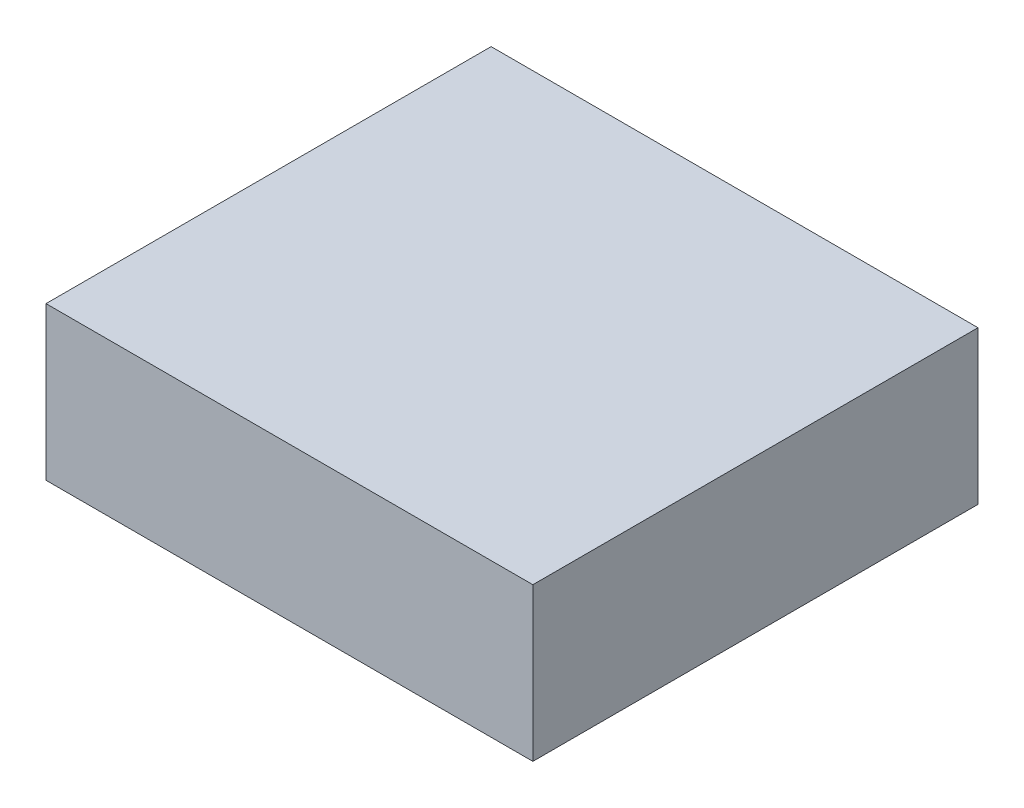
ISO-10303-21;
HEADER;
FILE_DESCRIPTION(('STEP AP214'),'2;1');
FILE_NAME('part.step','',(''),(''),'','','');
FILE_SCHEMA(('AUTOMOTIVE_DESIGN { 1 0 10303 214 1 1 1 1 }'));
ENDSEC;
DATA;
#1=APPLICATION_CONTEXT('core data for automotive mechanical design processes');
#2=APPLICATION_PROTOCOL_DEFINITION('international standard','automotive_design',2000,#1);
#3=PRODUCT_CONTEXT('',#1,'mechanical');
#4=PRODUCT('Part','Part','',(#3));
#5=PRODUCT_RELATED_PRODUCT_CATEGORY('part','',(#4));
#6=PRODUCT_DEFINITION_FORMATION('','',#4);
#7=PRODUCT_DEFINITION_CONTEXT('part definition',#1,'design');
#8=PRODUCT_DEFINITION('design','',#6,#7);
#9=PRODUCT_DEFINITION_SHAPE('','',#8);
#10=(LENGTH_UNIT() NAMED_UNIT(*) SI_UNIT(.MILLI.,.METRE.));
#11=(NAMED_UNIT(*) PLANE_ANGLE_UNIT() SI_UNIT($,.RADIAN.));
#12=(NAMED_UNIT(*) SI_UNIT($,.STERADIAN.) SOLID_ANGLE_UNIT());
#13=UNCERTAINTY_MEASURE_WITH_UNIT(LENGTH_MEASURE(1.E-05),#10,'distance_accuracy_value','');
#14=(GEOMETRIC_REPRESENTATION_CONTEXT(3) GLOBAL_UNCERTAINTY_ASSIGNED_CONTEXT((#13)) GLOBAL_UNIT_ASSIGNED_CONTEXT((#10,
#11,#12)) REPRESENTATION_CONTEXT('',''));
#15=CARTESIAN_POINT('',(0.,0.,0.));
#16=DIRECTION('',(0.,0.,1.));
#17=DIRECTION('',(1.,0.,0.));
#18=AXIS2_PLACEMENT_3D('',#15,#16,#17);
#19=CARTESIAN_POINT('',(-0.87499952,0.27500072,1.59999934));
#20=DIRECTION('',(0.,0.,1.));
#21=DIRECTION('',(1.,0.,0.));
#22=AXIS2_PLACEMENT_3D('',#19,#20,#21);
#23=PLANE('',#22);
#24=DIRECTION('',(0.,1.,0.));
#25=VECTOR('',#24,1.);
#26=CARTESIAN_POINT('',(-0.87499952,-0.27499818,1.59999934));
#27=LINE('',#26,#25);
#28=CARTESIAN_POINT('',(-0.87499952,-0.27499818,1.59999934));
#29=VERTEX_POINT('',#28);
#30=CARTESIAN_POINT('',(-0.87499952,0.27500072,1.59999934));
#31=VERTEX_POINT('',#30);
#32=EDGE_CURVE('E26',#29,#31,#27,.T.);
#33=ORIENTED_EDGE('',*,*,#32,.F.);
#34=DIRECTION('',(-1.,0.,0.));
#35=VECTOR('',#34,1.);
#36=CARTESIAN_POINT('',(0.87500206,-0.27499818,1.59999934));
#37=LINE('',#36,#35);
#38=CARTESIAN_POINT('',(0.87500206,-0.27499818,1.59999934));
#39=VERTEX_POINT('',#38);
#40=EDGE_CURVE('E58',#39,#29,#37,.T.);
#41=ORIENTED_EDGE('',*,*,#40,.F.);
#42=DIRECTION('',(0.,-1.,0.));
#43=VECTOR('',#42,1.);
#44=CARTESIAN_POINT('',(0.87500206,0.27500072,1.59999934));
#45=LINE('',#44,#43);
#46=CARTESIAN_POINT('',(0.87500206,0.27500072,1.59999934));
#47=VERTEX_POINT('',#46);
#48=EDGE_CURVE('E90',#47,#39,#45,.T.);
#49=ORIENTED_EDGE('',*,*,#48,.F.);
#50=DIRECTION('',(1.,0.,0.));
#51=VECTOR('',#50,1.);
#52=CARTESIAN_POINT('',(-0.87499952,0.27500072,1.59999934));
#53=LINE('',#52,#51);
#54=EDGE_CURVE('E95',#31,#47,#53,.T.);
#55=ORIENTED_EDGE('',*,*,#54,.F.);
#56=EDGE_LOOP('',(#33,#41,#49,#55));
#57=FACE_BOUND('',#56,.T.);
#58=ADVANCED_FACE('F17',(#57),#23,.T.);
#59=CARTESIAN_POINT('',(-0.87499952,0.27500072,0.));
#60=DIRECTION('',(0.,0.,1.));
#61=DIRECTION('',(1.,0.,0.));
#62=AXIS2_PLACEMENT_3D('',#59,#60,#61);
#63=PLANE('',#62);
#64=DIRECTION('',(1.,0.,0.));
#65=VECTOR('',#64,1.);
#66=CARTESIAN_POINT('',(-0.87499952,0.27500072,0.));
#67=LINE('',#66,#65);
#68=CARTESIAN_POINT('',(-0.87499952,0.27500072,0.));
#69=VERTEX_POINT('',#68);
#70=CARTESIAN_POINT('',(0.87500206,0.27500072,0.));
#71=VERTEX_POINT('',#70);
#72=EDGE_CURVE('E81',#69,#71,#67,.T.);
#73=ORIENTED_EDGE('',*,*,#72,.T.);
#74=DIRECTION('',(0.,-1.,0.));
#75=VECTOR('',#74,1.);
#76=CARTESIAN_POINT('',(0.87500206,0.27500072,0.));
#77=LINE('',#76,#75);
#78=CARTESIAN_POINT('',(0.87500206,-0.27499818,0.));
#79=VERTEX_POINT('',#78);
#80=EDGE_CURVE('E66',#71,#79,#77,.T.);
#81=ORIENTED_EDGE('',*,*,#80,.T.);
#82=DIRECTION('',(-1.,0.,0.));
#83=VECTOR('',#82,1.);
#84=CARTESIAN_POINT('',(0.87500206,-0.27499818,0.));
#85=LINE('',#84,#83);
#86=CARTESIAN_POINT('',(-0.87499952,-0.27499818,0.));
#87=VERTEX_POINT('',#86);
#88=EDGE_CURVE('E49',#79,#87,#85,.T.);
#89=ORIENTED_EDGE('',*,*,#88,.T.);
#90=DIRECTION('',(0.,1.,0.));
#91=VECTOR('',#90,1.);
#92=CARTESIAN_POINT('',(-0.87499952,-0.27499818,0.));
#93=LINE('',#92,#91);
#94=EDGE_CURVE('E11',#87,#69,#93,.T.);
#95=ORIENTED_EDGE('',*,*,#94,.T.);
#96=EDGE_LOOP('',(#73,#81,#89,#95));
#97=FACE_BOUND('',#96,.T.);
#98=ADVANCED_FACE('F80',(#97),#63,.F.);
#99=CARTESIAN_POINT('',(-0.87499952,-0.27499818,0.));
#100=DIRECTION('',(-1.,0.,0.));
#101=DIRECTION('',(0.,0.,1.));
#102=AXIS2_PLACEMENT_3D('',#99,#100,#101);
#103=PLANE('',#102);
#104=DIRECTION('',(0.,0.,1.));
#105=VECTOR('',#104,1.);
#106=CARTESIAN_POINT('',(-0.87499952,-0.27499818,0.));
#107=LINE('',#106,#105);
#108=EDGE_CURVE('E103',#87,#29,#107,.T.);
#109=ORIENTED_EDGE('',*,*,#108,.T.);
#110=ORIENTED_EDGE('',*,*,#32,.T.);
#111=DIRECTION('',(0.,0.,1.));
#112=VECTOR('',#111,1.);
#113=CARTESIAN_POINT('',(-0.87499952,0.27500072,0.));
#114=LINE('',#113,#112);
#115=EDGE_CURVE('E87',#69,#31,#114,.T.);
#116=ORIENTED_EDGE('',*,*,#115,.F.);
#117=ORIENTED_EDGE('',*,*,#94,.F.);
#118=EDGE_LOOP('',(#109,#110,#116,#117));
#119=FACE_BOUND('',#118,.T.);
#120=ADVANCED_FACE('F92',(#119),#103,.T.);
#121=CARTESIAN_POINT('',(0.87500206,-0.27499818,0.));
#122=DIRECTION('',(0.,-1.,0.));
#123=DIRECTION('',(0.,0.,-1.));
#124=AXIS2_PLACEMENT_3D('',#121,#122,#123);
#125=PLANE('',#124);
#126=DIRECTION('',(0.,0.,1.));
#127=VECTOR('',#126,1.);
#128=CARTESIAN_POINT('',(0.87500206,-0.27499818,0.));
#129=LINE('',#128,#127);
#130=EDGE_CURVE('E109',#79,#39,#129,.T.);
#131=ORIENTED_EDGE('',*,*,#130,.T.);
#132=ORIENTED_EDGE('',*,*,#40,.T.);
#133=ORIENTED_EDGE('',*,*,#108,.F.);
#134=ORIENTED_EDGE('',*,*,#88,.F.);
#135=EDGE_LOOP('',(#131,#132,#133,#134));
#136=FACE_BOUND('',#135,.T.);
#137=ADVANCED_FACE('F124',(#136),#125,.T.);
#138=CARTESIAN_POINT('',(0.87500206,0.27500072,0.));
#139=DIRECTION('',(1.,0.,0.));
#140=DIRECTION('',(0.,1.,0.));
#141=AXIS2_PLACEMENT_3D('',#138,#139,#140);
#142=PLANE('',#141);
#143=DIRECTION('',(0.,0.,1.));
#144=VECTOR('',#143,1.);
#145=CARTESIAN_POINT('',(0.87500206,0.27500072,0.));
#146=LINE('',#145,#144);
#147=EDGE_CURVE('E88',#71,#47,#146,.T.);
#148=ORIENTED_EDGE('',*,*,#147,.T.);
#149=ORIENTED_EDGE('',*,*,#48,.T.);
#150=ORIENTED_EDGE('',*,*,#130,.F.);
#151=ORIENTED_EDGE('',*,*,#80,.F.);
#152=EDGE_LOOP('',(#148,#149,#150,#151));
#153=FACE_BOUND('',#152,.T.);
#154=ADVANCED_FACE('F125',(#153),#142,.T.);
#155=CARTESIAN_POINT('',(-0.87499952,0.27500072,0.));
#156=DIRECTION('',(0.,1.,0.));
#157=DIRECTION('',(1.,0.,0.));
#158=AXIS2_PLACEMENT_3D('',#155,#156,#157);
#159=PLANE('',#158);
#160=ORIENTED_EDGE('',*,*,#115,.T.);
#161=ORIENTED_EDGE('',*,*,#54,.T.);
#162=ORIENTED_EDGE('',*,*,#147,.F.);
#163=ORIENTED_EDGE('',*,*,#72,.F.);
#164=EDGE_LOOP('',(#160,#161,#162,#163));
#165=FACE_BOUND('',#164,.T.);
#166=ADVANCED_FACE('F85',(#165),#159,.T.);
#167=CLOSED_SHELL('',(#58,#98,#120,#137,#154,#166));
#168=MANIFOLD_SOLID_BREP('B1',#167);
#169=ADVANCED_BREP_SHAPE_REPRESENTATION('',(#18,#168),#14);
#170=SHAPE_DEFINITION_REPRESENTATION(#9,#169);
ENDSEC;
END-ISO-10303-21;
